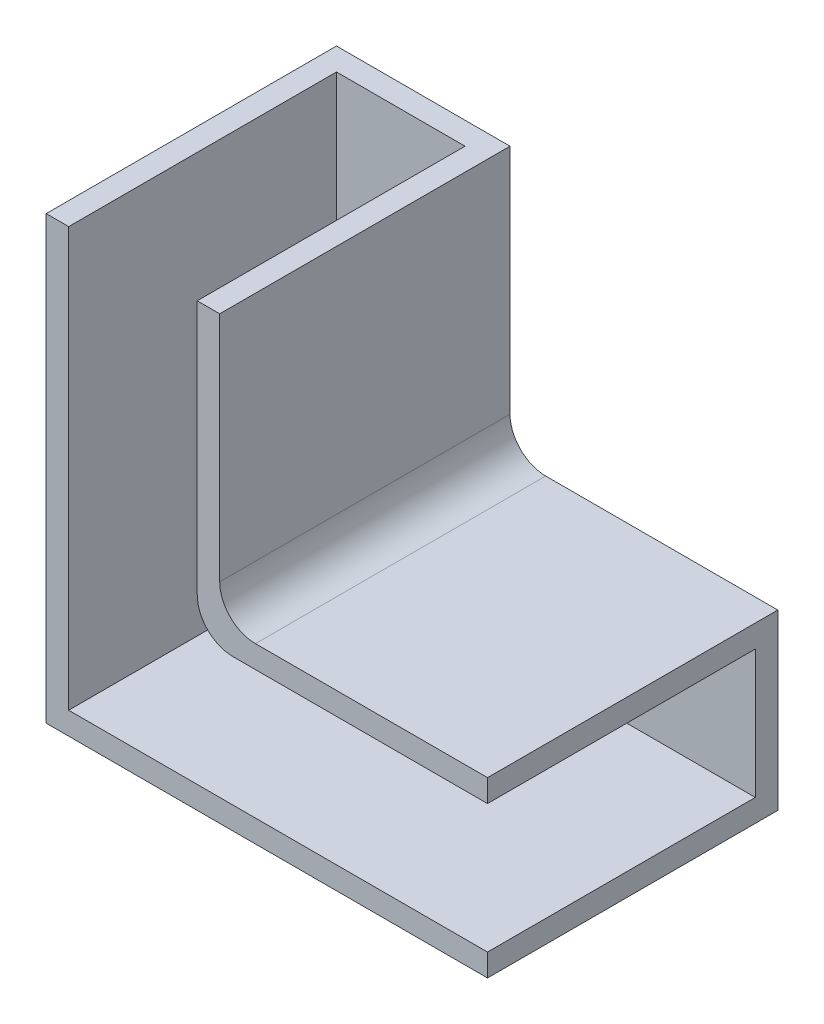
ISO-10303-21;
HEADER;
FILE_DESCRIPTION(('STEP AP214'),'2;1');
FILE_NAME('part.step','',(''),(''),'','','');
FILE_SCHEMA(('AUTOMOTIVE_DESIGN { 1 0 10303 214 1 1 1 1 }'));
ENDSEC;
DATA;
#1=APPLICATION_CONTEXT('core data for automotive mechanical design processes');
#2=APPLICATION_PROTOCOL_DEFINITION('international standard','automotive_design',2000,#1);
#3=PRODUCT_CONTEXT('',#1,'mechanical');
#4=PRODUCT('Part','Part','',(#3));
#5=PRODUCT_RELATED_PRODUCT_CATEGORY('part','',(#4));
#6=PRODUCT_DEFINITION_FORMATION('','',#4);
#7=PRODUCT_DEFINITION_CONTEXT('part definition',#1,'design');
#8=PRODUCT_DEFINITION('design','',#6,#7);
#9=PRODUCT_DEFINITION_SHAPE('','',#8);
#10=(LENGTH_UNIT() NAMED_UNIT(*) SI_UNIT(.MILLI.,.METRE.));
#11=(NAMED_UNIT(*) PLANE_ANGLE_UNIT() SI_UNIT($,.RADIAN.));
#12=(NAMED_UNIT(*) SI_UNIT($,.STERADIAN.) SOLID_ANGLE_UNIT());
#13=UNCERTAINTY_MEASURE_WITH_UNIT(LENGTH_MEASURE(1.E-05),#10,'distance_accuracy_value','');
#14=(GEOMETRIC_REPRESENTATION_CONTEXT(3) GLOBAL_UNCERTAINTY_ASSIGNED_CONTEXT((#13)) GLOBAL_UNIT_ASSIGNED_CONTEXT((#10,
#11,#12)) REPRESENTATION_CONTEXT('',''));
#15=CARTESIAN_POINT('',(0.,0.,0.));
#16=DIRECTION('',(0.,0.,1.));
#17=DIRECTION('',(1.,0.,0.));
#18=AXIS2_PLACEMENT_3D('',#15,#16,#17);
#19=CARTESIAN_POINT('',(0.,0.,0.8));
#20=DIRECTION('',(0.,0.,-1.));
#21=DIRECTION('',(-1.,0.,0.));
#22=AXIS2_PLACEMENT_3D('',#19,#20,#21);
#23=PLANE('',#22);
#24=DIRECTION('',(0.,-1.,0.));
#25=VECTOR('',#24,1.);
#26=CARTESIAN_POINT('',(5.372000102,5.372000102,0.8));
#27=LINE('',#26,#25);
#28=CARTESIAN_POINT('',(5.372000102,15.697000102,0.8));
#29=VERTEX_POINT('',#28);
#30=CARTESIAN_POINT('',(5.372000102,6.642000102,0.8));
#31=VERTEX_POINT('',#30);
#32=EDGE_CURVE('E162',#29,#31,#27,.T.);
#33=ORIENTED_EDGE('',*,*,#32,.F.);
#34=DIRECTION('',(-1.,0.,0.));
#35=VECTOR('',#34,1.);
#36=CARTESIAN_POINT('',(0.,15.697000102,0.8));
#37=LINE('',#36,#35);
#38=CARTESIAN_POINT('',(0.799999999999999,15.697000102,0.8));
#39=VERTEX_POINT('',#38);
#40=EDGE_CURVE('E212',#29,#39,#37,.T.);
#41=ORIENTED_EDGE('',*,*,#40,.T.);
#42=DIRECTION('',(0.,1.,0.));
#43=VECTOR('',#42,1.);
#44=CARTESIAN_POINT('',(0.799999999999999,15.697000102,0.8));
#45=LINE('',#44,#43);
#46=CARTESIAN_POINT('',(0.8,0.8,0.8));
#47=VERTEX_POINT('',#46);
#48=EDGE_CURVE('E177',#47,#39,#45,.T.);
#49=ORIENTED_EDGE('',*,*,#48,.F.);
#50=DIRECTION('',(-1.,0.,0.));
#51=VECTOR('',#50,1.);
#52=CARTESIAN_POINT('',(0.8,0.8,0.8));
#53=LINE('',#52,#51);
#54=CARTESIAN_POINT('',(15.697000102,0.8,0.8));
#55=VERTEX_POINT('',#54);
#56=EDGE_CURVE('E182',#55,#47,#53,.T.);
#57=ORIENTED_EDGE('',*,*,#56,.F.);
#58=DIRECTION('',(0.,1.,0.));
#59=VECTOR('',#58,1.);
#60=CARTESIAN_POINT('',(15.697000102,6.172000102,0.8));
#61=LINE('',#60,#59);
#62=CARTESIAN_POINT('',(15.697000102,5.372000102,0.8));
#63=VERTEX_POINT('',#62);
#64=EDGE_CURVE('E209',#55,#63,#61,.T.);
#65=ORIENTED_EDGE('',*,*,#64,.T.);
#66=DIRECTION('',(1.,0.,0.));
#67=VECTOR('',#66,1.);
#68=CARTESIAN_POINT('',(15.697000102,5.372000102,0.8));
#69=LINE('',#68,#67);
#70=CARTESIAN_POINT('',(6.642000102,5.372000102,0.8));
#71=VERTEX_POINT('',#70);
#72=EDGE_CURVE('E160',#71,#63,#69,.T.);
#73=ORIENTED_EDGE('',*,*,#72,.F.);
#74=CARTESIAN_POINT('',(6.642000102,6.642000102,0.8));
#75=DIRECTION('',(0.,0.,-1.));
#76=DIRECTION('',(-1.,0.,0.));
#77=AXIS2_PLACEMENT_3D('',#74,#75,#76);
#78=CIRCLE('',#77,1.27);
#79=EDGE_CURVE('E11',#71,#31,#78,.T.);
#80=ORIENTED_EDGE('',*,*,#79,.T.);
#81=EDGE_LOOP('',(#33,#41,#49,#57,#65,#73,#80));
#82=FACE_BOUND('',#81,.T.);
#83=ADVANCED_FACE('F32',(#82),#23,.F.);
#84=CARTESIAN_POINT('',(0.,0.,0.8));
#85=DIRECTION('',(0.,1.,0.));
#86=DIRECTION('',(0.,0.,1.));
#87=AXIS2_PLACEMENT_3D('',#84,#85,#86);
#88=PLANE('',#87);
#89=DIRECTION('',(1.,0.,0.));
#90=VECTOR('',#89,1.);
#91=CARTESIAN_POINT('',(0.,0.,0.));
#92=LINE('',#91,#90);
#93=CARTESIAN_POINT('',(0.,0.,0.));
#94=VERTEX_POINT('',#93);
#95=CARTESIAN_POINT('',(15.697000102,0.,0.));
#96=VERTEX_POINT('',#95);
#97=EDGE_CURVE('E208',#94,#96,#92,.T.);
#98=ORIENTED_EDGE('',*,*,#97,.T.);
#99=DIRECTION('',(0.,0.,-1.));
#100=VECTOR('',#99,1.);
#101=CARTESIAN_POINT('',(15.697000102,0.,0.8));
#102=LINE('',#101,#100);
#103=CARTESIAN_POINT('',(15.697000102,0.,10.325));
#104=VERTEX_POINT('',#103);
#105=EDGE_CURVE('E144',#104,#96,#102,.T.);
#106=ORIENTED_EDGE('',*,*,#105,.F.);
#107=DIRECTION('',(1.,0.,0.));
#108=VECTOR('',#107,1.);
#109=CARTESIAN_POINT('',(0.,0.,10.325));
#110=LINE('',#109,#108);
#111=CARTESIAN_POINT('',(0.,0.,10.325));
#112=VERTEX_POINT('',#111);
#113=EDGE_CURVE('E188',#112,#104,#110,.T.);
#114=ORIENTED_EDGE('',*,*,#113,.F.);
#115=DIRECTION('',(0.,0.,-1.));
#116=VECTOR('',#115,1.);
#117=CARTESIAN_POINT('',(0.,0.,0.8));
#118=LINE('',#117,#116);
#119=EDGE_CURVE('E215',#112,#94,#118,.T.);
#120=ORIENTED_EDGE('',*,*,#119,.T.);
#121=EDGE_LOOP('',(#98,#106,#114,#120));
#122=FACE_BOUND('',#121,.T.);
#123=ADVANCED_FACE('F280',(#122),#88,.F.);
#124=CARTESIAN_POINT('',(15.697000102,6.172000102,0.8));
#125=DIRECTION('',(-1.,0.,0.));
#126=DIRECTION('',(0.,0.,1.));
#127=AXIS2_PLACEMENT_3D('',#124,#125,#126);
#128=PLANE('',#127);
#129=DIRECTION('',(0.,1.,0.));
#130=VECTOR('',#129,1.);
#131=CARTESIAN_POINT('',(15.697000102,6.172000102,0.));
#132=LINE('',#131,#130);
#133=CARTESIAN_POINT('',(15.697000102,6.172000102,0.));
#134=VERTEX_POINT('',#133);
#135=EDGE_CURVE('E140',#96,#134,#132,.T.);
#136=ORIENTED_EDGE('',*,*,#135,.T.);
#137=DIRECTION('',(0.,0.,-1.));
#138=VECTOR('',#137,1.);
#139=CARTESIAN_POINT('',(15.697000102,6.172000102,0.8));
#140=LINE('',#139,#138);
#141=CARTESIAN_POINT('',(15.697000102,6.172000102,10.325));
#142=VERTEX_POINT('',#141);
#143=EDGE_CURVE('E133',#142,#134,#140,.T.);
#144=ORIENTED_EDGE('',*,*,#143,.F.);
#145=DIRECTION('',(0.,1.,0.));
#146=VECTOR('',#145,1.);
#147=CARTESIAN_POINT('',(15.697000102,6.172000102,10.325));
#148=LINE('',#147,#146);
#149=CARTESIAN_POINT('',(15.697000102,5.372000102,10.325));
#150=VERTEX_POINT('',#149);
#151=EDGE_CURVE('E138',#150,#142,#148,.T.);
#152=ORIENTED_EDGE('',*,*,#151,.F.);
#153=DIRECTION('',(0.,0.,-1.));
#154=VECTOR('',#153,1.);
#155=CARTESIAN_POINT('',(15.697000102,5.372000102,10.325));
#156=LINE('',#155,#154);
#157=EDGE_CURVE('E171',#150,#63,#156,.T.);
#158=ORIENTED_EDGE('',*,*,#157,.T.);
#159=ORIENTED_EDGE('',*,*,#64,.F.);
#160=DIRECTION('',(0.,0.,-1.));
#161=VECTOR('',#160,1.);
#162=CARTESIAN_POINT('',(15.697000102,0.800000000000001,10.325));
#163=LINE('',#162,#161);
#164=CARTESIAN_POINT('',(15.697000102,0.800000000000001,10.325));
#165=VERTEX_POINT('',#164);
#166=EDGE_CURVE('E202',#165,#55,#163,.T.);
#167=ORIENTED_EDGE('',*,*,#166,.F.);
#168=DIRECTION('',(0.,1.,0.));
#169=VECTOR('',#168,1.);
#170=CARTESIAN_POINT('',(15.697000102,0.800000000000001,10.325));
#171=LINE('',#170,#169);
#172=EDGE_CURVE('E191',#104,#165,#171,.T.);
#173=ORIENTED_EDGE('',*,*,#172,.F.);
#174=ORIENTED_EDGE('',*,*,#105,.T.);
#175=EDGE_LOOP('',(#136,#144,#152,#158,#159,#167,#173,#174));
#176=FACE_BOUND('',#175,.T.);
#177=ADVANCED_FACE('F135',(#176),#128,.F.);
#178=CARTESIAN_POINT('',(6.172000102,6.172000102,0.8));
#179=DIRECTION('',(0.,-1.,0.));
#180=DIRECTION('',(1.,0.,0.));
#181=AXIS2_PLACEMENT_3D('',#178,#179,#180);
#182=PLANE('',#181);
#183=DIRECTION('',(-1.,0.,0.));
#184=VECTOR('',#183,1.);
#185=CARTESIAN_POINT('',(6.172000102,6.172000102,0.));
#186=LINE('',#185,#184);
#187=CARTESIAN_POINT('',(7.442000102,6.172000102,0.));
#188=VERTEX_POINT('',#187);
#189=EDGE_CURVE('E219',#134,#188,#186,.T.);
#190=ORIENTED_EDGE('',*,*,#189,.T.);
#191=DIRECTION('',(0.,0.,-1.));
#192=VECTOR('',#191,1.);
#193=CARTESIAN_POINT('',(7.442000102,6.172000102,10.325));
#194=LINE('',#193,#192);
#195=CARTESIAN_POINT('',(7.442000102,6.172000102,10.325));
#196=VERTEX_POINT('',#195);
#197=EDGE_CURVE('E151',#188,#196,#194,.F.);
#198=ORIENTED_EDGE('',*,*,#197,.T.);
#199=DIRECTION('',(-1.,0.,0.));
#200=VECTOR('',#199,1.);
#201=CARTESIAN_POINT('',(15.697000102,6.172000102,10.325));
#202=LINE('',#201,#200);
#203=EDGE_CURVE('E148',#142,#196,#202,.T.);
#204=ORIENTED_EDGE('',*,*,#203,.F.);
#205=ORIENTED_EDGE('',*,*,#143,.T.);
#206=EDGE_LOOP('',(#190,#198,#204,#205));
#207=FACE_BOUND('',#206,.T.);
#208=ADVANCED_FACE('F149',(#207),#182,.F.);
#209=CARTESIAN_POINT('',(6.17200010199999,15.697000102,0.8));
#210=DIRECTION('',(-1.,0.,0.));
#211=DIRECTION('',(0.,-1.,0.));
#212=AXIS2_PLACEMENT_3D('',#209,#210,#211);
#213=PLANE('',#212);
#214=DIRECTION('',(0.,1.,0.));
#215=VECTOR('',#214,1.);
#216=CARTESIAN_POINT('',(6.172000102,6.172000102,10.325));
#217=LINE('',#216,#215);
#218=CARTESIAN_POINT('',(6.172000102,7.442000102,10.325));
#219=VERTEX_POINT('',#218);
#220=CARTESIAN_POINT('',(6.17200010199999,15.697000102,10.325));
#221=VERTEX_POINT('',#220);
#222=EDGE_CURVE('E154',#219,#221,#217,.T.);
#223=ORIENTED_EDGE('',*,*,#222,.F.);
#224=DIRECTION('',(0.,0.,-1.));
#225=VECTOR('',#224,1.);
#226=CARTESIAN_POINT('',(6.172000102,7.442000102,0.));
#227=LINE('',#226,#225);
#228=CARTESIAN_POINT('',(6.172000102,7.44200010200001,0.));
#229=VERTEX_POINT('',#228);
#230=EDGE_CURVE('E234',#219,#229,#227,.T.);
#231=ORIENTED_EDGE('',*,*,#230,.T.);
#232=DIRECTION('',(0.,1.,0.));
#233=VECTOR('',#232,1.);
#234=CARTESIAN_POINT('',(6.17200010199999,15.697000102,0.));
#235=LINE('',#234,#233);
#236=CARTESIAN_POINT('',(6.17200010199999,15.697000102,0.));
#237=VERTEX_POINT('',#236);
#238=EDGE_CURVE('E221',#229,#237,#235,.T.);
#239=ORIENTED_EDGE('',*,*,#238,.T.);
#240=DIRECTION('',(0.,0.,-1.));
#241=VECTOR('',#240,1.);
#242=CARTESIAN_POINT('',(6.17200010199999,15.697000102,0.8));
#243=LINE('',#242,#241);
#244=EDGE_CURVE('E145',#221,#237,#243,.T.);
#245=ORIENTED_EDGE('',*,*,#244,.F.);
#246=EDGE_LOOP('',(#223,#231,#239,#245));
#247=FACE_BOUND('',#246,.T.);
#248=ADVANCED_FACE('F250',(#247),#213,.F.);
#249=CARTESIAN_POINT('',(0.,15.697000102,0.8));
#250=DIRECTION('',(0.,-1.,0.));
#251=DIRECTION('',(0.,0.,-1.));
#252=AXIS2_PLACEMENT_3D('',#249,#250,#251);
#253=PLANE('',#252);
#254=DIRECTION('',(-1.,0.,0.));
#255=VECTOR('',#254,1.);
#256=CARTESIAN_POINT('',(0.,15.697000102,0.));
#257=LINE('',#256,#255);
#258=CARTESIAN_POINT('',(0.,15.697000102,0.));
#259=VERTEX_POINT('',#258);
#260=EDGE_CURVE('E223',#237,#259,#257,.T.);
#261=ORIENTED_EDGE('',*,*,#260,.T.);
#262=DIRECTION('',(0.,0.,-1.));
#263=VECTOR('',#262,1.);
#264=CARTESIAN_POINT('',(0.,15.697000102,0.8));
#265=LINE('',#264,#263);
#266=CARTESIAN_POINT('',(0.,15.697000102,10.325));
#267=VERTEX_POINT('',#266);
#268=EDGE_CURVE('E228',#267,#259,#265,.T.);
#269=ORIENTED_EDGE('',*,*,#268,.F.);
#270=DIRECTION('',(-1.,0.,0.));
#271=VECTOR('',#270,1.);
#272=CARTESIAN_POINT('',(0.799999999999999,15.697000102,10.325));
#273=LINE('',#272,#271);
#274=CARTESIAN_POINT('',(0.799999999999999,15.697000102,10.325));
#275=VERTEX_POINT('',#274);
#276=EDGE_CURVE('E181',#275,#267,#273,.T.);
#277=ORIENTED_EDGE('',*,*,#276,.F.);
#278=DIRECTION('',(0.,0.,-1.));
#279=VECTOR('',#278,1.);
#280=CARTESIAN_POINT('',(0.799999999999999,15.697000102,10.325));
#281=LINE('',#280,#279);
#282=EDGE_CURVE('E205',#275,#39,#281,.T.);
#283=ORIENTED_EDGE('',*,*,#282,.T.);
#284=ORIENTED_EDGE('',*,*,#40,.F.);
#285=DIRECTION('',(0.,0.,-1.));
#286=VECTOR('',#285,1.);
#287=CARTESIAN_POINT('',(5.372000102,15.697000102,10.325));
#288=LINE('',#287,#286);
#289=CARTESIAN_POINT('',(5.372000102,15.697000102,10.325));
#290=VERTEX_POINT('',#289);
#291=EDGE_CURVE('E174',#290,#29,#288,.T.);
#292=ORIENTED_EDGE('',*,*,#291,.F.);
#293=DIRECTION('',(-1.,0.,0.));
#294=VECTOR('',#293,1.);
#295=CARTESIAN_POINT('',(5.372000102,15.697000102,10.325));
#296=LINE('',#295,#294);
#297=EDGE_CURVE('E166',#221,#290,#296,.T.);
#298=ORIENTED_EDGE('',*,*,#297,.F.);
#299=ORIENTED_EDGE('',*,*,#244,.T.);
#300=EDGE_LOOP('',(#261,#269,#277,#283,#284,#292,#298,#299));
#301=FACE_BOUND('',#300,.T.);
#302=ADVANCED_FACE('F260',(#301),#253,.F.);
#303=CARTESIAN_POINT('',(0.,0.,0.8));
#304=DIRECTION('',(1.,0.,0.));
#305=DIRECTION('',(0.,1.,0.));
#306=AXIS2_PLACEMENT_3D('',#303,#304,#305);
#307=PLANE('',#306);
#308=DIRECTION('',(0.,-1.,0.));
#309=VECTOR('',#308,1.);
#310=CARTESIAN_POINT('',(0.,0.,0.));
#311=LINE('',#310,#309);
#312=EDGE_CURVE('E213',#259,#94,#311,.T.);
#313=ORIENTED_EDGE('',*,*,#312,.T.);
#314=ORIENTED_EDGE('',*,*,#119,.F.);
#315=DIRECTION('',(0.,-1.,0.));
#316=VECTOR('',#315,1.);
#317=CARTESIAN_POINT('',(0.,15.697000102,10.325));
#318=LINE('',#317,#316);
#319=EDGE_CURVE('E185',#267,#112,#318,.T.);
#320=ORIENTED_EDGE('',*,*,#319,.F.);
#321=ORIENTED_EDGE('',*,*,#268,.T.);
#322=EDGE_LOOP('',(#313,#314,#320,#321));
#323=FACE_BOUND('',#322,.T.);
#324=ADVANCED_FACE('F282',(#323),#307,.F.);
#325=CARTESIAN_POINT('',(0.,0.,0.));
#326=DIRECTION('',(0.,0.,-1.));
#327=DIRECTION('',(-1.,0.,0.));
#328=AXIS2_PLACEMENT_3D('',#325,#326,#327);
#329=PLANE('',#328);
#330=ORIENTED_EDGE('',*,*,#97,.F.);
#331=ORIENTED_EDGE('',*,*,#312,.F.);
#332=ORIENTED_EDGE('',*,*,#260,.F.);
#333=ORIENTED_EDGE('',*,*,#238,.F.);
#334=CARTESIAN_POINT('',(7.442000102,7.442000102,0.));
#335=DIRECTION('',(0.,0.,-1.));
#336=DIRECTION('',(-1.,0.,0.));
#337=AXIS2_PLACEMENT_3D('',#334,#335,#336);
#338=CIRCLE('',#337,1.27);
#339=EDGE_CURVE('E244',#229,#188,#338,.F.);
#340=ORIENTED_EDGE('',*,*,#339,.T.);
#341=ORIENTED_EDGE('',*,*,#189,.F.);
#342=ORIENTED_EDGE('',*,*,#135,.F.);
#343=EDGE_LOOP('',(#330,#331,#332,#333,#340,#341,#342));
#344=FACE_BOUND('',#343,.T.);
#345=ADVANCED_FACE('F256',(#344),#329,.T.);
#346=CARTESIAN_POINT('',(0.799999999999999,15.697000102,10.325));
#347=DIRECTION('',(-1.,0.,0.));
#348=DIRECTION('',(0.,-1.,0.));
#349=AXIS2_PLACEMENT_3D('',#346,#347,#348);
#350=PLANE('',#349);
#351=ORIENTED_EDGE('',*,*,#48,.T.);
#352=ORIENTED_EDGE('',*,*,#282,.F.);
#353=DIRECTION('',(0.,1.,0.));
#354=VECTOR('',#353,1.);
#355=CARTESIAN_POINT('',(0.799999999999999,15.697000102,10.325));
#356=LINE('',#355,#354);
#357=CARTESIAN_POINT('',(0.8,0.8,10.325));
#358=VERTEX_POINT('',#357);
#359=EDGE_CURVE('E178',#358,#275,#356,.T.);
#360=ORIENTED_EDGE('',*,*,#359,.F.);
#361=DIRECTION('',(0.,0.,-1.));
#362=VECTOR('',#361,1.);
#363=CARTESIAN_POINT('',(0.8,0.8,10.325));
#364=LINE('',#363,#362);
#365=EDGE_CURVE('E195',#358,#47,#364,.T.);
#366=ORIENTED_EDGE('',*,*,#365,.T.);
#367=EDGE_LOOP('',(#351,#352,#360,#366));
#368=FACE_BOUND('',#367,.T.);
#369=ADVANCED_FACE('F285',(#368),#350,.F.);
#370=CARTESIAN_POINT('',(0.8,0.8,10.325));
#371=DIRECTION('',(0.,-1.,0.));
#372=DIRECTION('',(1.,0.,0.));
#373=AXIS2_PLACEMENT_3D('',#370,#371,#372);
#374=PLANE('',#373);
#375=ORIENTED_EDGE('',*,*,#56,.T.);
#376=ORIENTED_EDGE('',*,*,#365,.F.);
#377=DIRECTION('',(-1.,0.,0.));
#378=VECTOR('',#377,1.);
#379=CARTESIAN_POINT('',(0.8,0.8,10.325));
#380=LINE('',#379,#378);
#381=EDGE_CURVE('E193',#165,#358,#380,.T.);
#382=ORIENTED_EDGE('',*,*,#381,.F.);
#383=ORIENTED_EDGE('',*,*,#166,.T.);
#384=EDGE_LOOP('',(#375,#376,#382,#383));
#385=FACE_BOUND('',#384,.T.);
#386=ADVANCED_FACE('F272',(#385),#374,.F.);
#387=CARTESIAN_POINT('',(0.,0.,10.325));
#388=DIRECTION('',(0.,0.,1.));
#389=DIRECTION('',(1.,0.,0.));
#390=AXIS2_PLACEMENT_3D('',#387,#388,#389);
#391=PLANE('',#390);
#392=ORIENTED_EDGE('',*,*,#359,.T.);
#393=ORIENTED_EDGE('',*,*,#276,.T.);
#394=ORIENTED_EDGE('',*,*,#319,.T.);
#395=ORIENTED_EDGE('',*,*,#113,.T.);
#396=ORIENTED_EDGE('',*,*,#172,.T.);
#397=ORIENTED_EDGE('',*,*,#381,.T.);
#398=EDGE_LOOP('',(#392,#393,#394,#395,#396,#397));
#399=FACE_BOUND('',#398,.T.);
#400=ADVANCED_FACE('F276',(#399),#391,.T.);
#401=CARTESIAN_POINT('',(5.372000102,5.372000102,10.325));
#402=DIRECTION('',(1.,0.,0.));
#403=DIRECTION('',(0.,0.,-1.));
#404=AXIS2_PLACEMENT_3D('',#401,#402,#403);
#405=PLANE('',#404);
#406=ORIENTED_EDGE('',*,*,#32,.T.);
#407=DIRECTION('',(0.,0.,-1.));
#408=VECTOR('',#407,1.);
#409=CARTESIAN_POINT('',(5.372000102,6.642000102,10.325));
#410=LINE('',#409,#408);
#411=CARTESIAN_POINT('',(5.372000102,6.642000102,10.325));
#412=VERTEX_POINT('',#411);
#413=EDGE_CURVE('E47',#31,#412,#410,.F.);
#414=ORIENTED_EDGE('',*,*,#413,.T.);
#415=DIRECTION('',(0.,-1.,0.));
#416=VECTOR('',#415,1.);
#417=CARTESIAN_POINT('',(5.372000102,5.372000102,10.325));
#418=LINE('',#417,#416);
#419=EDGE_CURVE('E168',#290,#412,#418,.T.);
#420=ORIENTED_EDGE('',*,*,#419,.F.);
#421=ORIENTED_EDGE('',*,*,#291,.T.);
#422=EDGE_LOOP('',(#406,#414,#420,#421));
#423=FACE_BOUND('',#422,.T.);
#424=ADVANCED_FACE('F286',(#423),#405,.F.);
#425=CARTESIAN_POINT('',(15.697000102,5.372000102,10.325));
#426=DIRECTION('',(0.,1.,0.));
#427=DIRECTION('',(-1.,0.,0.));
#428=AXIS2_PLACEMENT_3D('',#425,#426,#427);
#429=PLANE('',#428);
#430=DIRECTION('',(1.,0.,0.));
#431=VECTOR('',#430,1.);
#432=CARTESIAN_POINT('',(15.697000102,5.372000102,10.325));
#433=LINE('',#432,#431);
#434=CARTESIAN_POINT('',(6.642000102,5.372000102,10.325));
#435=VERTEX_POINT('',#434);
#436=EDGE_CURVE('E158',#435,#150,#433,.T.);
#437=ORIENTED_EDGE('',*,*,#436,.F.);
#438=DIRECTION('',(0.,0.,-1.));
#439=VECTOR('',#438,1.);
#440=CARTESIAN_POINT('',(6.642000102,5.372000102,10.325));
#441=LINE('',#440,#439);
#442=EDGE_CURVE('E238',#435,#71,#441,.T.);
#443=ORIENTED_EDGE('',*,*,#442,.T.);
#444=ORIENTED_EDGE('',*,*,#72,.T.);
#445=ORIENTED_EDGE('',*,*,#157,.F.);
#446=EDGE_LOOP('',(#437,#443,#444,#445));
#447=FACE_BOUND('',#446,.T.);
#448=ADVANCED_FACE('F266',(#447),#429,.F.);
#449=CARTESIAN_POINT('',(0.,0.,10.325));
#450=DIRECTION('',(0.,0.,-1.));
#451=DIRECTION('',(-1.,0.,0.));
#452=AXIS2_PLACEMENT_3D('',#449,#450,#451);
#453=PLANE('',#452);
#454=ORIENTED_EDGE('',*,*,#419,.T.);
#455=CARTESIAN_POINT('',(6.642000102,6.642000102,10.325));
#456=DIRECTION('',(0.,0.,-1.));
#457=DIRECTION('',(-1.,0.,0.));
#458=AXIS2_PLACEMENT_3D('',#455,#456,#457);
#459=CIRCLE('',#458,1.27);
#460=EDGE_CURVE('E242',#412,#435,#459,.F.);
#461=ORIENTED_EDGE('',*,*,#460,.T.);
#462=ORIENTED_EDGE('',*,*,#436,.T.);
#463=ORIENTED_EDGE('',*,*,#151,.T.);
#464=ORIENTED_EDGE('',*,*,#203,.T.);
#465=CARTESIAN_POINT('',(7.442000102,7.442000102,10.325));
#466=DIRECTION('',(0.,0.,-1.));
#467=DIRECTION('',(-1.,0.,0.));
#468=AXIS2_PLACEMENT_3D('',#465,#466,#467);
#469=CIRCLE('',#468,1.27);
#470=EDGE_CURVE('E40',#196,#219,#469,.T.);
#471=ORIENTED_EDGE('',*,*,#470,.T.);
#472=ORIENTED_EDGE('',*,*,#222,.T.);
#473=ORIENTED_EDGE('',*,*,#297,.T.);
#474=EDGE_LOOP('',(#454,#461,#462,#463,#464,#471,#472,#473));
#475=FACE_BOUND('',#474,.T.);
#476=ADVANCED_FACE('F156',(#475),#453,.F.);
#477=CARTESIAN_POINT('',(7.442000102,7.442000102,0.8));
#478=DIRECTION('',(0.,0.,1.));
#479=DIRECTION('',(1.,0.,0.));
#480=AXIS2_PLACEMENT_3D('',#477,#478,#479);
#481=CYLINDRICAL_SURFACE('',#480,1.27);
#482=ORIENTED_EDGE('',*,*,#470,.F.);
#483=ORIENTED_EDGE('',*,*,#197,.F.);
#484=ORIENTED_EDGE('',*,*,#339,.F.);
#485=ORIENTED_EDGE('',*,*,#230,.F.);
#486=EDGE_LOOP('',(#482,#483,#484,#485));
#487=FACE_BOUND('',#486,.T.);
#488=ADVANCED_FACE('F253',(#487),#481,.F.);
#489=CARTESIAN_POINT('',(6.642000102,6.642000102,10.325));
#490=DIRECTION('',(0.,0.,-1.));
#491=DIRECTION('',(-1.,0.,0.));
#492=AXIS2_PLACEMENT_3D('',#489,#490,#491);
#493=CYLINDRICAL_SURFACE('',#492,1.27);
#494=ORIENTED_EDGE('',*,*,#460,.F.);
#495=ORIENTED_EDGE('',*,*,#413,.F.);
#496=ORIENTED_EDGE('',*,*,#79,.F.);
#497=ORIENTED_EDGE('',*,*,#442,.F.);
#498=EDGE_LOOP('',(#494,#495,#496,#497));
#499=FACE_BOUND('',#498,.T.);
#500=ADVANCED_FACE('F34',(#499),#493,.T.);
#501=CLOSED_SHELL('',(#83,#123,#177,#208,#248,#302,#324,#345,#369,#386,#400,#424,#448,#476,#488,#500));
#502=MANIFOLD_SOLID_BREP('B2',#501);
#503=ADVANCED_BREP_SHAPE_REPRESENTATION('',(#18,#502),#14);
#504=SHAPE_DEFINITION_REPRESENTATION(#9,#503);
ENDSEC;
END-ISO-10303-21;
